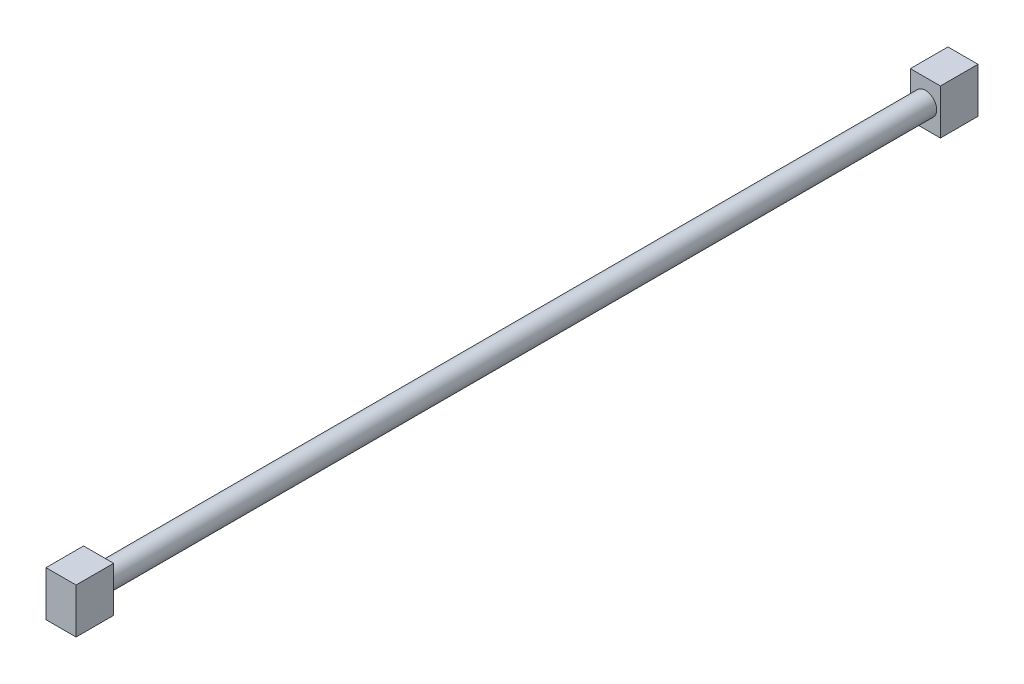
ISO-10303-21;
HEADER;
FILE_DESCRIPTION(('STEP AP214'),'2;1');
FILE_NAME('part.step','',(''),(''),'','','');
FILE_SCHEMA(('AUTOMOTIVE_DESIGN { 1 0 10303 214 1 1 1 1 }'));
ENDSEC;
DATA;
#1=APPLICATION_CONTEXT('core data for automotive mechanical design processes');
#2=APPLICATION_PROTOCOL_DEFINITION('international standard','automotive_design',2000,#1);
#3=PRODUCT_CONTEXT('',#1,'mechanical');
#4=PRODUCT('Part','Part','',(#3));
#5=PRODUCT_RELATED_PRODUCT_CATEGORY('part','',(#4));
#6=PRODUCT_DEFINITION_FORMATION('','',#4);
#7=PRODUCT_DEFINITION_CONTEXT('part definition',#1,'design');
#8=PRODUCT_DEFINITION('design','',#6,#7);
#9=PRODUCT_DEFINITION_SHAPE('','',#8);
#10=(LENGTH_UNIT() NAMED_UNIT(*) SI_UNIT(.MILLI.,.METRE.));
#11=(NAMED_UNIT(*) PLANE_ANGLE_UNIT() SI_UNIT($,.RADIAN.));
#12=(NAMED_UNIT(*) SI_UNIT($,.STERADIAN.) SOLID_ANGLE_UNIT());
#13=UNCERTAINTY_MEASURE_WITH_UNIT(LENGTH_MEASURE(1.E-05),#10,'distance_accuracy_value','');
#14=(GEOMETRIC_REPRESENTATION_CONTEXT(3) GLOBAL_UNCERTAINTY_ASSIGNED_CONTEXT((#13)) GLOBAL_UNIT_ASSIGNED_CONTEXT((#10,
#11,#12)) REPRESENTATION_CONTEXT('',''));
#15=CARTESIAN_POINT('',(0.,0.,0.));
#16=DIRECTION('',(0.,0.,1.));
#17=DIRECTION('',(1.,0.,0.));
#18=AXIS2_PLACEMENT_3D('',#15,#16,#17);
#19=CARTESIAN_POINT('',(2.54,-3.81,6.35));
#20=DIRECTION('',(-1.,0.,0.));
#21=DIRECTION('',(0.,0.,1.));
#22=AXIS2_PLACEMENT_3D('',#19,#20,#21);
#23=PLANE('',#22);
#24=DIRECTION('',(0.,1.,0.));
#25=VECTOR('',#24,1.);
#26=CARTESIAN_POINT('',(2.54,-3.81,0.));
#27=LINE('',#26,#25);
#28=CARTESIAN_POINT('',(2.54,-3.81,0.));
#29=VERTEX_POINT('',#28);
#30=CARTESIAN_POINT('',(2.54,3.81,0.));
#31=VERTEX_POINT('',#30);
#32=EDGE_CURVE('E143',#29,#31,#27,.T.);
#33=ORIENTED_EDGE('',*,*,#32,.T.);
#34=DIRECTION('',(0.,0.,-1.));
#35=VECTOR('',#34,1.);
#36=CARTESIAN_POINT('',(2.54,3.81,6.35));
#37=LINE('',#36,#35);
#38=CARTESIAN_POINT('',(2.54,3.81,6.35));
#39=VERTEX_POINT('',#38);
#40=EDGE_CURVE('E42',#39,#31,#37,.T.);
#41=ORIENTED_EDGE('',*,*,#40,.F.);
#42=DIRECTION('',(0.,1.,0.));
#43=VECTOR('',#42,1.);
#44=CARTESIAN_POINT('',(2.54,-3.81,6.35));
#45=LINE('',#44,#43);
#46=CARTESIAN_POINT('',(2.54,-3.81,6.35));
#47=VERTEX_POINT('',#46);
#48=EDGE_CURVE('E149',#47,#39,#45,.T.);
#49=ORIENTED_EDGE('',*,*,#48,.F.);
#50=DIRECTION('',(0.,0.,-1.));
#51=VECTOR('',#50,1.);
#52=CARTESIAN_POINT('',(2.54,-3.81,6.35));
#53=LINE('',#52,#51);
#54=EDGE_CURVE('E155',#47,#29,#53,.T.);
#55=ORIENTED_EDGE('',*,*,#54,.T.);
#56=EDGE_LOOP('',(#33,#41,#49,#55));
#57=FACE_BOUND('',#56,.T.);
#58=ADVANCED_FACE('F39',(#57),#23,.F.);
#59=CARTESIAN_POINT('',(-2.54,3.81,6.35));
#60=DIRECTION('',(0.,-1.,0.));
#61=DIRECTION('',(0.,0.,-1.));
#62=AXIS2_PLACEMENT_3D('',#59,#60,#61);
#63=PLANE('',#62);
#64=DIRECTION('',(-1.,0.,0.));
#65=VECTOR('',#64,1.);
#66=CARTESIAN_POINT('',(-2.54,3.81,0.));
#67=LINE('',#66,#65);
#68=CARTESIAN_POINT('',(-2.54,3.81,0.));
#69=VERTEX_POINT('',#68);
#70=EDGE_CURVE('E158',#31,#69,#67,.T.);
#71=ORIENTED_EDGE('',*,*,#70,.T.);
#72=DIRECTION('',(0.,0.,-1.));
#73=VECTOR('',#72,1.);
#74=CARTESIAN_POINT('',(-2.54,3.81,6.35));
#75=LINE('',#74,#73);
#76=CARTESIAN_POINT('',(-2.54,3.81,6.35));
#77=VERTEX_POINT('',#76);
#78=EDGE_CURVE('E164',#77,#69,#75,.T.);
#79=ORIENTED_EDGE('',*,*,#78,.F.);
#80=DIRECTION('',(-1.,0.,0.));
#81=VECTOR('',#80,1.);
#82=CARTESIAN_POINT('',(-2.54,3.81,6.35));
#83=LINE('',#82,#81);
#84=EDGE_CURVE('E88',#39,#77,#83,.T.);
#85=ORIENTED_EDGE('',*,*,#84,.F.);
#86=ORIENTED_EDGE('',*,*,#40,.T.);
#87=EDGE_LOOP('',(#71,#79,#85,#86));
#88=FACE_BOUND('',#87,.T.);
#89=ADVANCED_FACE('F167',(#88),#63,.F.);
#90=CARTESIAN_POINT('',(-2.54,-3.81,6.35));
#91=DIRECTION('',(1.,0.,0.));
#92=DIRECTION('',(0.,0.,-1.));
#93=AXIS2_PLACEMENT_3D('',#90,#91,#92);
#94=PLANE('',#93);
#95=DIRECTION('',(0.,-1.,0.));
#96=VECTOR('',#95,1.);
#97=CARTESIAN_POINT('',(-2.54,-3.81,0.));
#98=LINE('',#97,#96);
#99=CARTESIAN_POINT('',(-2.54,-3.81,0.));
#100=VERTEX_POINT('',#99);
#101=EDGE_CURVE('E74',#69,#100,#98,.T.);
#102=ORIENTED_EDGE('',*,*,#101,.T.);
#103=DIRECTION('',(0.,0.,-1.));
#104=VECTOR('',#103,1.);
#105=CARTESIAN_POINT('',(-2.54,-3.81,6.35));
#106=LINE('',#105,#104);
#107=CARTESIAN_POINT('',(-2.54,-3.81,6.35));
#108=VERTEX_POINT('',#107);
#109=EDGE_CURVE('E163',#108,#100,#106,.T.);
#110=ORIENTED_EDGE('',*,*,#109,.F.);
#111=DIRECTION('',(0.,-1.,0.));
#112=VECTOR('',#111,1.);
#113=CARTESIAN_POINT('',(-2.54,-3.81,6.35));
#114=LINE('',#113,#112);
#115=EDGE_CURVE('E152',#77,#108,#114,.T.);
#116=ORIENTED_EDGE('',*,*,#115,.F.);
#117=ORIENTED_EDGE('',*,*,#78,.T.);
#118=EDGE_LOOP('',(#102,#110,#116,#117));
#119=FACE_BOUND('',#118,.T.);
#120=ADVANCED_FACE('F191',(#119),#94,.F.);
#121=CARTESIAN_POINT('',(-2.54,-3.81,6.35));
#122=DIRECTION('',(0.,1.,0.));
#123=DIRECTION('',(0.,0.,1.));
#124=AXIS2_PLACEMENT_3D('',#121,#122,#123);
#125=PLANE('',#124);
#126=DIRECTION('',(1.,0.,0.));
#127=VECTOR('',#126,1.);
#128=CARTESIAN_POINT('',(-2.54,-3.81,0.));
#129=LINE('',#128,#127);
#130=EDGE_CURVE('E80',#100,#29,#129,.T.);
#131=ORIENTED_EDGE('',*,*,#130,.T.);
#132=ORIENTED_EDGE('',*,*,#54,.F.);
#133=DIRECTION('',(1.,0.,0.));
#134=VECTOR('',#133,1.);
#135=CARTESIAN_POINT('',(-2.54,-3.81,6.35));
#136=LINE('',#135,#134);
#137=EDGE_CURVE('E56',#108,#47,#136,.T.);
#138=ORIENTED_EDGE('',*,*,#137,.F.);
#139=ORIENTED_EDGE('',*,*,#109,.T.);
#140=EDGE_LOOP('',(#131,#132,#138,#139));
#141=FACE_BOUND('',#140,.T.);
#142=ADVANCED_FACE('F183',(#141),#125,.F.);
#143=CARTESIAN_POINT('',(0.,0.,6.35));
#144=DIRECTION('',(0.,0.,-1.));
#145=DIRECTION('',(-1.,0.,0.));
#146=AXIS2_PLACEMENT_3D('',#143,#144,#145);
#147=PLANE('',#146);
#148=CARTESIAN_POINT('',(0.,0.,6.35));
#149=DIRECTION('',(0.,0.,1.));
#150=DIRECTION('',(1.,0.,0.));
#151=AXIS2_PLACEMENT_3D('',#148,#149,#150);
#152=CIRCLE('',#151,1.905);
#153=CARTESIAN_POINT('',(1.905,0.,6.35));
#154=VERTEX_POINT('',#153);
#155=EDGE_CURVE('E11',#154,#154,#152,.T.);
#156=ORIENTED_EDGE('',*,*,#155,.F.);
#157=EDGE_LOOP('',(#156));
#158=FACE_BOUND('',#157,.T.);
#159=ORIENTED_EDGE('',*,*,#48,.T.);
#160=ORIENTED_EDGE('',*,*,#84,.T.);
#161=ORIENTED_EDGE('',*,*,#115,.T.);
#162=ORIENTED_EDGE('',*,*,#137,.T.);
#163=EDGE_LOOP('',(#159,#160,#161,#162));
#164=FACE_BOUND('',#163,.T.);
#165=ADVANCED_FACE('F175',(#158,#164),#147,.F.);
#166=CARTESIAN_POINT('',(0.,0.,0.));
#167=DIRECTION('',(0.,0.,-1.));
#168=DIRECTION('',(-1.,0.,0.));
#169=AXIS2_PLACEMENT_3D('',#166,#167,#168);
#170=PLANE('',#169);
#171=ORIENTED_EDGE('',*,*,#32,.F.);
#172=ORIENTED_EDGE('',*,*,#130,.F.);
#173=ORIENTED_EDGE('',*,*,#101,.F.);
#174=ORIENTED_EDGE('',*,*,#70,.F.);
#175=EDGE_LOOP('',(#171,#172,#173,#174));
#176=FACE_BOUND('',#175,.T.);
#177=ADVANCED_FACE('F172',(#176),#170,.T.);
#178=CARTESIAN_POINT('',(0.,0.,146.05));
#179=DIRECTION('',(0.,0.,-1.));
#180=DIRECTION('',(-1.,0.,0.));
#181=AXIS2_PLACEMENT_3D('',#178,#179,#180);
#182=CYLINDRICAL_SURFACE('',#181,1.905);
#183=CARTESIAN_POINT('',(0.,0.,146.05));
#184=DIRECTION('',(0.,0.,1.));
#185=DIRECTION('',(1.,0.,0.));
#186=AXIS2_PLACEMENT_3D('',#183,#184,#185);
#187=CIRCLE('',#186,1.905);
#188=CARTESIAN_POINT('',(1.905,0.,146.05));
#189=VERTEX_POINT('',#188);
#190=EDGE_CURVE('E140',#189,#189,#187,.T.);
#191=ORIENTED_EDGE('',*,*,#190,.F.);
#192=EDGE_LOOP('',(#191));
#193=FACE_BOUND('',#192,.T.);
#194=ORIENTED_EDGE('',*,*,#155,.T.);
#195=EDGE_LOOP('',(#194));
#196=FACE_BOUND('',#195,.T.);
#197=ADVANCED_FACE('F174',(#193,#196),#182,.T.);
#198=CARTESIAN_POINT('',(2.54,-3.81,152.4));
#199=DIRECTION('',(-1.,0.,0.));
#200=DIRECTION('',(0.,0.,1.));
#201=AXIS2_PLACEMENT_3D('',#198,#199,#200);
#202=PLANE('',#201);
#203=DIRECTION('',(0.,1.,0.));
#204=VECTOR('',#203,1.);
#205=CARTESIAN_POINT('',(2.54,-3.81,146.05));
#206=LINE('',#205,#204);
#207=CARTESIAN_POINT('',(2.54,-3.81,146.05));
#208=VERTEX_POINT('',#207);
#209=CARTESIAN_POINT('',(2.54,3.81,146.05));
#210=VERTEX_POINT('',#209);
#211=EDGE_CURVE('E139',#208,#210,#206,.T.);
#212=ORIENTED_EDGE('',*,*,#211,.T.);
#213=DIRECTION('',(0.,0.,-1.));
#214=VECTOR('',#213,1.);
#215=CARTESIAN_POINT('',(2.54,3.81,152.4));
#216=LINE('',#215,#214);
#217=CARTESIAN_POINT('',(2.54,3.81,152.4));
#218=VERTEX_POINT('',#217);
#219=EDGE_CURVE('E119',#218,#210,#216,.T.);
#220=ORIENTED_EDGE('',*,*,#219,.F.);
#221=DIRECTION('',(0.,1.,0.));
#222=VECTOR('',#221,1.);
#223=CARTESIAN_POINT('',(2.54,-3.81,152.4));
#224=LINE('',#223,#222);
#225=CARTESIAN_POINT('',(2.54,-3.81,152.4));
#226=VERTEX_POINT('',#225);
#227=EDGE_CURVE('E126',#226,#218,#224,.T.);
#228=ORIENTED_EDGE('',*,*,#227,.F.);
#229=DIRECTION('',(0.,0.,-1.));
#230=VECTOR('',#229,1.);
#231=CARTESIAN_POINT('',(2.54,-3.81,152.4));
#232=LINE('',#231,#230);
#233=EDGE_CURVE('E326',#226,#208,#232,.T.);
#234=ORIENTED_EDGE('',*,*,#233,.T.);
#235=EDGE_LOOP('',(#212,#220,#228,#234));
#236=FACE_BOUND('',#235,.T.);
#237=ADVANCED_FACE('F137',(#236),#202,.F.);
#238=CARTESIAN_POINT('',(-2.54,3.81,152.4));
#239=DIRECTION('',(0.,-1.,0.));
#240=DIRECTION('',(0.,0.,-1.));
#241=AXIS2_PLACEMENT_3D('',#238,#239,#240);
#242=PLANE('',#241);
#243=DIRECTION('',(-1.,0.,0.));
#244=VECTOR('',#243,1.);
#245=CARTESIAN_POINT('',(-2.54,3.81,146.05));
#246=LINE('',#245,#244);
#247=CARTESIAN_POINT('',(-2.54,3.81,146.05));
#248=VERTEX_POINT('',#247);
#249=EDGE_CURVE('E317',#210,#248,#246,.T.);
#250=ORIENTED_EDGE('',*,*,#249,.T.);
#251=DIRECTION('',(0.,0.,-1.));
#252=VECTOR('',#251,1.);
#253=CARTESIAN_POINT('',(-2.54,3.81,152.4));
#254=LINE('',#253,#252);
#255=CARTESIAN_POINT('',(-2.54,3.81,152.4));
#256=VERTEX_POINT('',#255);
#257=EDGE_CURVE('E122',#256,#248,#254,.T.);
#258=ORIENTED_EDGE('',*,*,#257,.F.);
#259=DIRECTION('',(-1.,0.,0.));
#260=VECTOR('',#259,1.);
#261=CARTESIAN_POINT('',(-2.54,3.81,152.4));
#262=LINE('',#261,#260);
#263=EDGE_CURVE('E115',#218,#256,#262,.T.);
#264=ORIENTED_EDGE('',*,*,#263,.F.);
#265=ORIENTED_EDGE('',*,*,#219,.T.);
#266=EDGE_LOOP('',(#250,#258,#264,#265));
#267=FACE_BOUND('',#266,.T.);
#268=ADVANCED_FACE('F117',(#267),#242,.F.);
#269=CARTESIAN_POINT('',(-2.54,-3.81,152.4));
#270=DIRECTION('',(1.,0.,0.));
#271=DIRECTION('',(0.,0.,-1.));
#272=AXIS2_PLACEMENT_3D('',#269,#270,#271);
#273=PLANE('',#272);
#274=DIRECTION('',(0.,-1.,0.));
#275=VECTOR('',#274,1.);
#276=CARTESIAN_POINT('',(-2.54,-3.81,146.05));
#277=LINE('',#276,#275);
#278=CARTESIAN_POINT('',(-2.54,-3.81,146.05));
#279=VERTEX_POINT('',#278);
#280=EDGE_CURVE('E319',#248,#279,#277,.T.);
#281=ORIENTED_EDGE('',*,*,#280,.T.);
#282=DIRECTION('',(0.,0.,-1.));
#283=VECTOR('',#282,1.);
#284=CARTESIAN_POINT('',(-2.54,-3.81,152.4));
#285=LINE('',#284,#283);
#286=CARTESIAN_POINT('',(-2.54,-3.81,152.4));
#287=VERTEX_POINT('',#286);
#288=EDGE_CURVE('E145',#287,#279,#285,.T.);
#289=ORIENTED_EDGE('',*,*,#288,.F.);
#290=DIRECTION('',(0.,-1.,0.));
#291=VECTOR('',#290,1.);
#292=CARTESIAN_POINT('',(-2.54,-3.81,152.4));
#293=LINE('',#292,#291);
#294=EDGE_CURVE('E125',#256,#287,#293,.T.);
#295=ORIENTED_EDGE('',*,*,#294,.F.);
#296=ORIENTED_EDGE('',*,*,#257,.T.);
#297=EDGE_LOOP('',(#281,#289,#295,#296));
#298=FACE_BOUND('',#297,.T.);
#299=ADVANCED_FACE('F233',(#298),#273,.F.);
#300=CARTESIAN_POINT('',(-2.54,-3.81,152.4));
#301=DIRECTION('',(0.,1.,0.));
#302=DIRECTION('',(0.,0.,1.));
#303=AXIS2_PLACEMENT_3D('',#300,#301,#302);
#304=PLANE('',#303);
#305=DIRECTION('',(1.,0.,0.));
#306=VECTOR('',#305,1.);
#307=CARTESIAN_POINT('',(-2.54,-3.81,146.05));
#308=LINE('',#307,#306);
#309=EDGE_CURVE('E135',#279,#208,#308,.T.);
#310=ORIENTED_EDGE('',*,*,#309,.T.);
#311=ORIENTED_EDGE('',*,*,#233,.F.);
#312=DIRECTION('',(1.,0.,0.));
#313=VECTOR('',#312,1.);
#314=CARTESIAN_POINT('',(-2.54,-3.81,152.4));
#315=LINE('',#314,#313);
#316=EDGE_CURVE('E131',#287,#226,#315,.T.);
#317=ORIENTED_EDGE('',*,*,#316,.F.);
#318=ORIENTED_EDGE('',*,*,#288,.T.);
#319=EDGE_LOOP('',(#310,#311,#317,#318));
#320=FACE_BOUND('',#319,.T.);
#321=ADVANCED_FACE('F243',(#320),#304,.F.);
#322=CARTESIAN_POINT('',(0.,0.,152.4));
#323=DIRECTION('',(0.,0.,-1.));
#324=DIRECTION('',(-1.,0.,0.));
#325=AXIS2_PLACEMENT_3D('',#322,#323,#324);
#326=PLANE('',#325);
#327=ORIENTED_EDGE('',*,*,#227,.T.);
#328=ORIENTED_EDGE('',*,*,#263,.T.);
#329=ORIENTED_EDGE('',*,*,#294,.T.);
#330=ORIENTED_EDGE('',*,*,#316,.T.);
#331=EDGE_LOOP('',(#327,#328,#329,#330));
#332=FACE_BOUND('',#331,.T.);
#333=ADVANCED_FACE('F129',(#332),#326,.F.);
#334=CARTESIAN_POINT('',(0.,0.,146.05));
#335=DIRECTION('',(0.,0.,-1.));
#336=DIRECTION('',(-1.,0.,0.));
#337=AXIS2_PLACEMENT_3D('',#334,#335,#336);
#338=PLANE('',#337);
#339=ORIENTED_EDGE('',*,*,#190,.T.);
#340=EDGE_LOOP('',(#339));
#341=FACE_BOUND('',#340,.T.);
#342=ORIENTED_EDGE('',*,*,#211,.F.);
#343=ORIENTED_EDGE('',*,*,#309,.F.);
#344=ORIENTED_EDGE('',*,*,#280,.F.);
#345=ORIENTED_EDGE('',*,*,#249,.F.);
#346=EDGE_LOOP('',(#342,#343,#344,#345));
#347=FACE_BOUND('',#346,.T.);
#348=ADVANCED_FACE('F264',(#341,#347),#338,.T.);
#349=CLOSED_SHELL('',(#58,#89,#120,#142,#165,#177,#197,#237,#268,#299,#321,#333,#348));
#350=MANIFOLD_SOLID_BREP('B2',#349);
#351=ADVANCED_BREP_SHAPE_REPRESENTATION('',(#18,#350),#14);
#352=SHAPE_DEFINITION_REPRESENTATION(#9,#351);
ENDSEC;
END-ISO-10303-21;
